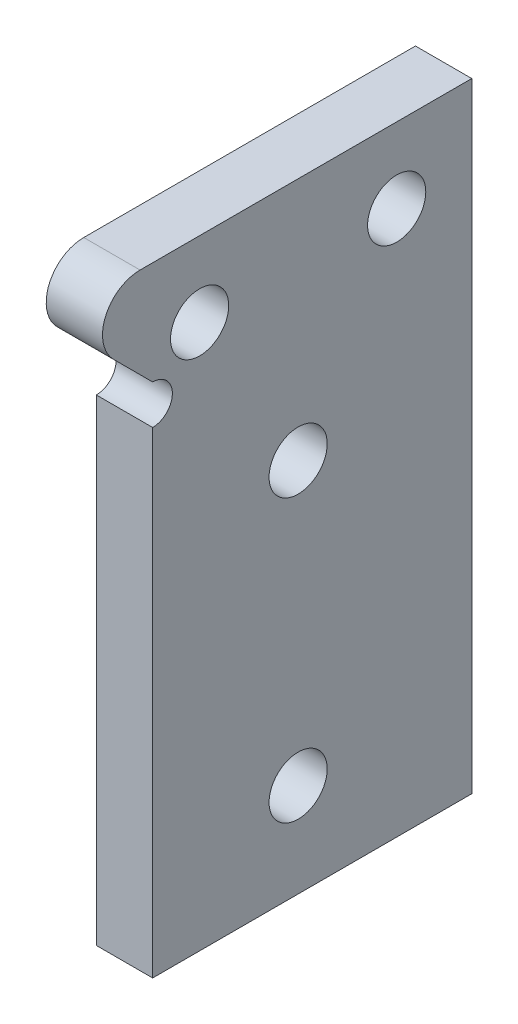
ISO-10303-21;
HEADER;
FILE_DESCRIPTION(('STEP AP214'),'2;1');
FILE_NAME('part.step','',(''),(''),'','','');
FILE_SCHEMA(('AUTOMOTIVE_DESIGN { 1 0 10303 214 1 1 1 1 }'));
ENDSEC;
DATA;
#1=APPLICATION_CONTEXT('core data for automotive mechanical design processes');
#2=APPLICATION_PROTOCOL_DEFINITION('international standard','automotive_design',2000,#1);
#3=PRODUCT_CONTEXT('',#1,'mechanical');
#4=PRODUCT('Part','Part','',(#3));
#5=PRODUCT_RELATED_PRODUCT_CATEGORY('part','',(#4));
#6=PRODUCT_DEFINITION_FORMATION('','',#4);
#7=PRODUCT_DEFINITION_CONTEXT('part definition',#1,'design');
#8=PRODUCT_DEFINITION('design','',#6,#7);
#9=PRODUCT_DEFINITION_SHAPE('','',#8);
#10=(LENGTH_UNIT() NAMED_UNIT(*) SI_UNIT(.MILLI.,.METRE.));
#11=(NAMED_UNIT(*) PLANE_ANGLE_UNIT() SI_UNIT($,.RADIAN.));
#12=(NAMED_UNIT(*) SI_UNIT($,.STERADIAN.) SOLID_ANGLE_UNIT());
#13=UNCERTAINTY_MEASURE_WITH_UNIT(LENGTH_MEASURE(1.E-05),#10,'distance_accuracy_value','');
#14=(GEOMETRIC_REPRESENTATION_CONTEXT(3) GLOBAL_UNCERTAINTY_ASSIGNED_CONTEXT((#13)) GLOBAL_UNIT_ASSIGNED_CONTEXT((#10,
#11,#12)) REPRESENTATION_CONTEXT('',''));
#15=CARTESIAN_POINT('',(0.,0.,0.));
#16=DIRECTION('',(0.,0.,1.));
#17=DIRECTION('',(1.,0.,0.));
#18=AXIS2_PLACEMENT_3D('',#15,#16,#17);
#19=CARTESIAN_POINT('',(3.,26.45,0.));
#20=DIRECTION('',(-1.,0.,0.));
#21=DIRECTION('',(0.,0.,1.));
#22=AXIS2_PLACEMENT_3D('',#19,#20,#21);
#23=CYLINDRICAL_SURFACE('',#22,1.05);
#24=CARTESIAN_POINT('',(0.,26.45,0.));
#25=DIRECTION('',(1.,0.,0.));
#26=DIRECTION('',(0.,0.,-1.));
#27=AXIS2_PLACEMENT_3D('',#24,#25,#26);
#28=CIRCLE('',#27,1.05);
#29=CARTESIAN_POINT('',(0.,25.4,0.));
#30=VERTEX_POINT('',#29);
#31=CARTESIAN_POINT('',(0.,27.5,0.));
#32=VERTEX_POINT('',#31);
#33=EDGE_CURVE('E96',#30,#32,#28,.T.);
#34=ORIENTED_EDGE('',*,*,#33,.F.);
#35=DIRECTION('',(-1.,0.,0.));
#36=VECTOR('',#35,1.);
#37=CARTESIAN_POINT('',(3.,25.4,0.));
#38=LINE('',#37,#36);
#39=CARTESIAN_POINT('',(3.,25.4,0.));
#40=VERTEX_POINT('',#39);
#41=EDGE_CURVE('E91',#40,#30,#38,.T.);
#42=ORIENTED_EDGE('',*,*,#41,.F.);
#43=CARTESIAN_POINT('',(3.,26.45,0.));
#44=DIRECTION('',(1.,0.,0.));
#45=DIRECTION('',(0.,0.,-1.));
#46=AXIS2_PLACEMENT_3D('',#43,#44,#45);
#47=CIRCLE('',#46,1.05);
#48=CARTESIAN_POINT('',(3.,27.5,0.));
#49=VERTEX_POINT('',#48);
#50=EDGE_CURVE('E93',#40,#49,#47,.T.);
#51=ORIENTED_EDGE('',*,*,#50,.T.);
#52=DIRECTION('',(-1.,0.,0.));
#53=VECTOR('',#52,1.);
#54=CARTESIAN_POINT('',(3.,27.5,0.));
#55=LINE('',#54,#53);
#56=EDGE_CURVE('E133',#49,#32,#55,.T.);
#57=ORIENTED_EDGE('',*,*,#56,.T.);
#58=EDGE_LOOP('',(#34,#42,#51,#57));
#59=FACE_BOUND('',#58,.T.);
#60=ADVANCED_FACE('F34',(#59),#23,.F.);
#61=CARTESIAN_POINT('',(3.,0.,0.));
#62=DIRECTION('',(0.,0.,1.));
#63=DIRECTION('',(1.,0.,0.));
#64=AXIS2_PLACEMENT_3D('',#61,#62,#63);
#65=PLANE('',#64);
#66=DIRECTION('',(0.,1.,0.));
#67=VECTOR('',#66,1.);
#68=CARTESIAN_POINT('',(0.,0.,0.));
#69=LINE('',#68,#67);
#70=CARTESIAN_POINT('',(0.,0.,0.));
#71=VERTEX_POINT('',#70);
#72=EDGE_CURVE('E141',#71,#30,#69,.T.);
#73=ORIENTED_EDGE('',*,*,#72,.F.);
#74=DIRECTION('',(-1.,0.,0.));
#75=VECTOR('',#74,1.);
#76=CARTESIAN_POINT('',(3.,0.,0.));
#77=LINE('',#76,#75);
#78=CARTESIAN_POINT('',(3.,0.,0.));
#79=VERTEX_POINT('',#78);
#80=EDGE_CURVE('E102',#79,#71,#77,.T.);
#81=ORIENTED_EDGE('',*,*,#80,.F.);
#82=DIRECTION('',(0.,1.,0.));
#83=VECTOR('',#82,1.);
#84=CARTESIAN_POINT('',(3.,0.,0.));
#85=LINE('',#84,#83);
#86=EDGE_CURVE('E109',#79,#40,#85,.T.);
#87=ORIENTED_EDGE('',*,*,#86,.T.);
#88=ORIENTED_EDGE('',*,*,#41,.T.);
#89=EDGE_LOOP('',(#73,#81,#87,#88));
#90=FACE_BOUND('',#89,.T.);
#91=ADVANCED_FACE('F115',(#90),#65,.T.);
#92=CARTESIAN_POINT('',(3.,0.,0.));
#93=DIRECTION('',(0.,-1.,0.));
#94=DIRECTION('',(0.,0.,-1.));
#95=AXIS2_PLACEMENT_3D('',#92,#93,#94);
#96=PLANE('',#95);
#97=DIRECTION('',(0.,0.,1.));
#98=VECTOR('',#97,1.);
#99=CARTESIAN_POINT('',(0.,0.,0.));
#100=LINE('',#99,#98);
#101=CARTESIAN_POINT('',(0.,0.,-17.));
#102=VERTEX_POINT('',#101);
#103=EDGE_CURVE('E143',#102,#71,#100,.T.);
#104=ORIENTED_EDGE('',*,*,#103,.F.);
#105=DIRECTION('',(-1.,0.,0.));
#106=VECTOR('',#105,1.);
#107=CARTESIAN_POINT('',(3.,0.,-17.));
#108=LINE('',#107,#106);
#109=CARTESIAN_POINT('',(3.,0.,-17.));
#110=VERTEX_POINT('',#109);
#111=EDGE_CURVE('E164',#110,#102,#108,.T.);
#112=ORIENTED_EDGE('',*,*,#111,.F.);
#113=DIRECTION('',(0.,0.,1.));
#114=VECTOR('',#113,1.);
#115=CARTESIAN_POINT('',(3.,0.,0.));
#116=LINE('',#115,#114);
#117=EDGE_CURVE('E116',#110,#79,#116,.T.);
#118=ORIENTED_EDGE('',*,*,#117,.T.);
#119=ORIENTED_EDGE('',*,*,#80,.T.);
#120=EDGE_LOOP('',(#104,#112,#118,#119));
#121=FACE_BOUND('',#120,.T.);
#122=ADVANCED_FACE('F180',(#121),#96,.T.);
#123=CARTESIAN_POINT('',(3.,0.,-17.));
#124=DIRECTION('',(0.,0.,-1.));
#125=DIRECTION('',(0.,1.,0.));
#126=AXIS2_PLACEMENT_3D('',#123,#124,#125);
#127=PLANE('',#126);
#128=DIRECTION('',(0.,-1.,0.));
#129=VECTOR('',#128,1.);
#130=CARTESIAN_POINT('',(0.,0.,-17.));
#131=LINE('',#130,#129);
#132=CARTESIAN_POINT('',(0.,33.,-17.));
#133=VERTEX_POINT('',#132);
#134=EDGE_CURVE('E146',#133,#102,#131,.T.);
#135=ORIENTED_EDGE('',*,*,#134,.F.);
#136=DIRECTION('',(-1.,0.,0.));
#137=VECTOR('',#136,1.);
#138=CARTESIAN_POINT('',(3.,33.,-17.));
#139=LINE('',#138,#137);
#140=CARTESIAN_POINT('',(3.,33.,-17.));
#141=VERTEX_POINT('',#140);
#142=EDGE_CURVE('E161',#141,#133,#139,.T.);
#143=ORIENTED_EDGE('',*,*,#142,.F.);
#144=DIRECTION('',(0.,-1.,0.));
#145=VECTOR('',#144,1.);
#146=CARTESIAN_POINT('',(3.,0.,-17.));
#147=LINE('',#146,#145);
#148=EDGE_CURVE('E118',#141,#110,#147,.T.);
#149=ORIENTED_EDGE('',*,*,#148,.T.);
#150=ORIENTED_EDGE('',*,*,#111,.T.);
#151=EDGE_LOOP('',(#135,#143,#149,#150));
#152=FACE_BOUND('',#151,.T.);
#153=ADVANCED_FACE('F184',(#152),#127,.T.);
#154=CARTESIAN_POINT('',(3.,33.,0.));
#155=DIRECTION('',(0.,1.,0.));
#156=DIRECTION('',(0.,0.,1.));
#157=AXIS2_PLACEMENT_3D('',#154,#155,#156);
#158=PLANE('',#157);
#159=DIRECTION('',(0.,0.,-1.));
#160=VECTOR('',#159,1.);
#161=CARTESIAN_POINT('',(0.,33.,0.));
#162=LINE('',#161,#160);
#163=CARTESIAN_POINT('',(0.,33.,0.671572875253822));
#164=VERTEX_POINT('',#163);
#165=EDGE_CURVE('E149',#164,#133,#162,.T.);
#166=ORIENTED_EDGE('',*,*,#165,.F.);
#167=DIRECTION('',(-1.,0.,0.));
#168=VECTOR('',#167,1.);
#169=CARTESIAN_POINT('',(3.,33.,0.671572875253822));
#170=LINE('',#169,#168);
#171=CARTESIAN_POINT('',(3.,33.,0.671572875253822));
#172=VERTEX_POINT('',#171);
#173=EDGE_CURVE('E42',#164,#172,#170,.F.);
#174=ORIENTED_EDGE('',*,*,#173,.T.);
#175=DIRECTION('',(0.,0.,-1.));
#176=VECTOR('',#175,1.);
#177=CARTESIAN_POINT('',(3.,33.,0.));
#178=LINE('',#177,#176);
#179=EDGE_CURVE('E124',#172,#141,#178,.T.);
#180=ORIENTED_EDGE('',*,*,#179,.T.);
#181=ORIENTED_EDGE('',*,*,#142,.T.);
#182=EDGE_LOOP('',(#166,#174,#180,#181));
#183=FACE_BOUND('',#182,.T.);
#184=ADVANCED_FACE('F185',(#183),#158,.T.);
#185=CARTESIAN_POINT('',(3.,29.,-13.));
#186=DIRECTION('',(-1.,0.,0.));
#187=DIRECTION('',(0.,0.,1.));
#188=AXIS2_PLACEMENT_3D('',#185,#186,#187);
#189=CYLINDRICAL_SURFACE('',#188,1.55);
#190=CARTESIAN_POINT('',(3.,29.,-13.));
#191=DIRECTION('',(1.,0.,0.));
#192=DIRECTION('',(0.,0.,-1.));
#193=AXIS2_PLACEMENT_3D('',#190,#191,#192);
#194=CIRCLE('',#193,1.55);
#195=CARTESIAN_POINT('',(3.,29.,-14.55));
#196=VERTEX_POINT('',#195);
#197=EDGE_CURVE('E127',#196,#196,#194,.T.);
#198=ORIENTED_EDGE('',*,*,#197,.T.);
#199=EDGE_LOOP('',(#198));
#200=FACE_BOUND('',#199,.T.);
#201=CARTESIAN_POINT('',(0.,29.,-13.));
#202=DIRECTION('',(1.,0.,0.));
#203=DIRECTION('',(0.,0.,-1.));
#204=AXIS2_PLACEMENT_3D('',#201,#202,#203);
#205=CIRCLE('',#204,1.55);
#206=CARTESIAN_POINT('',(0.,29.,-14.55));
#207=VERTEX_POINT('',#206);
#208=EDGE_CURVE('E153',#207,#207,#205,.T.);
#209=ORIENTED_EDGE('',*,*,#208,.F.);
#210=EDGE_LOOP('',(#209));
#211=FACE_BOUND('',#210,.T.);
#212=ADVANCED_FACE('F229',(#200,#211),#189,.F.);
#213=CARTESIAN_POINT('',(3.,13.75,-13.75));
#214=DIRECTION('',(0.,-0.707106781186549,0.707106781186546));
#215=DIRECTION('',(0.,-0.707106781186546,-0.707106781186549));
#216=AXIS2_PLACEMENT_3D('',#213,#214,#215);
#217=PLANE('',#216);
#218=DIRECTION('',(0.,0.707106781186546,0.707106781186549));
#219=VECTOR('',#218,1.);
#220=CARTESIAN_POINT('',(3.,13.75,-13.75));
#221=LINE('',#220,#219);
#222=CARTESIAN_POINT('',(3.,29.5857864376269,2.08578643762692));
#223=VERTEX_POINT('',#222);
#224=EDGE_CURVE('E112',#49,#223,#221,.T.);
#225=ORIENTED_EDGE('',*,*,#224,.T.);
#226=DIRECTION('',(-1.,0.,0.));
#227=VECTOR('',#226,1.);
#228=CARTESIAN_POINT('',(3.,29.5857864376269,2.08578643762691));
#229=LINE('',#228,#227);
#230=CARTESIAN_POINT('',(0.,29.5857864376269,2.08578643762692));
#231=VERTEX_POINT('',#230);
#232=EDGE_CURVE('E101',#223,#231,#229,.T.);
#233=ORIENTED_EDGE('',*,*,#232,.T.);
#234=DIRECTION('',(0.,0.707106781186546,0.707106781186549));
#235=VECTOR('',#234,1.);
#236=CARTESIAN_POINT('',(0.,13.75,-13.75));
#237=LINE('',#236,#235);
#238=EDGE_CURVE('E151',#32,#231,#237,.T.);
#239=ORIENTED_EDGE('',*,*,#238,.F.);
#240=ORIENTED_EDGE('',*,*,#56,.F.);
#241=EDGE_LOOP('',(#225,#233,#239,#240));
#242=FACE_BOUND('',#241,.T.);
#243=ADVANCED_FACE('F172',(#242),#217,.T.);
#244=CARTESIAN_POINT('',(3.,20.,-7.75));
#245=DIRECTION('',(-1.,0.,0.));
#246=DIRECTION('',(0.,0.,1.));
#247=AXIS2_PLACEMENT_3D('',#244,#245,#246);
#248=CYLINDRICAL_SURFACE('',#247,1.55);
#249=CARTESIAN_POINT('',(3.,20.,-7.75));
#250=DIRECTION('',(1.,0.,0.));
#251=DIRECTION('',(0.,0.,-1.));
#252=AXIS2_PLACEMENT_3D('',#249,#250,#251);
#253=CIRCLE('',#252,1.55);
#254=CARTESIAN_POINT('',(3.,20.,-9.3));
#255=VERTEX_POINT('',#254);
#256=EDGE_CURVE('E113',#255,#255,#253,.T.);
#257=ORIENTED_EDGE('',*,*,#256,.T.);
#258=EDGE_LOOP('',(#257));
#259=FACE_BOUND('',#258,.T.);
#260=CARTESIAN_POINT('',(0.,20.,-7.75));
#261=DIRECTION('',(1.,0.,0.));
#262=DIRECTION('',(0.,0.,-1.));
#263=AXIS2_PLACEMENT_3D('',#260,#261,#262);
#264=CIRCLE('',#263,1.55);
#265=CARTESIAN_POINT('',(0.,20.,-9.3));
#266=VERTEX_POINT('',#265);
#267=EDGE_CURVE('E137',#266,#266,#264,.T.);
#268=ORIENTED_EDGE('',*,*,#267,.F.);
#269=EDGE_LOOP('',(#268));
#270=FACE_BOUND('',#269,.T.);
#271=ADVANCED_FACE('F200',(#259,#270),#248,.F.);
#272=CARTESIAN_POINT('',(3.,5.,-7.75));
#273=DIRECTION('',(-1.,0.,0.));
#274=DIRECTION('',(0.,0.,1.));
#275=AXIS2_PLACEMENT_3D('',#272,#273,#274);
#276=CYLINDRICAL_SURFACE('',#275,1.55);
#277=CARTESIAN_POINT('',(3.,5.,-7.75));
#278=DIRECTION('',(1.,0.,0.));
#279=DIRECTION('',(0.,0.,-1.));
#280=AXIS2_PLACEMENT_3D('',#277,#278,#279);
#281=CIRCLE('',#280,1.55);
#282=CARTESIAN_POINT('',(3.,5.,-9.3));
#283=VERTEX_POINT('',#282);
#284=EDGE_CURVE('E159',#283,#283,#281,.T.);
#285=ORIENTED_EDGE('',*,*,#284,.T.);
#286=EDGE_LOOP('',(#285));
#287=FACE_BOUND('',#286,.T.);
#288=CARTESIAN_POINT('',(0.,5.,-7.75));
#289=DIRECTION('',(1.,0.,0.));
#290=DIRECTION('',(0.,0.,-1.));
#291=AXIS2_PLACEMENT_3D('',#288,#289,#290);
#292=CIRCLE('',#291,1.55);
#293=CARTESIAN_POINT('',(0.,5.,-9.3));
#294=VERTEX_POINT('',#293);
#295=EDGE_CURVE('E134',#294,#294,#292,.T.);
#296=ORIENTED_EDGE('',*,*,#295,.F.);
#297=EDGE_LOOP('',(#296));
#298=FACE_BOUND('',#297,.T.);
#299=ADVANCED_FACE('F202',(#287,#298),#276,.F.);
#300=CARTESIAN_POINT('',(3.,29.,-2.5));
#301=DIRECTION('',(-1.,0.,0.));
#302=DIRECTION('',(0.,0.,1.));
#303=AXIS2_PLACEMENT_3D('',#300,#301,#302);
#304=CYLINDRICAL_SURFACE('',#303,1.55);
#305=CARTESIAN_POINT('',(3.,29.,-2.5));
#306=DIRECTION('',(1.,0.,0.));
#307=DIRECTION('',(0.,0.,-1.));
#308=AXIS2_PLACEMENT_3D('',#305,#306,#307);
#309=CIRCLE('',#308,1.55);
#310=CARTESIAN_POINT('',(3.,29.,-4.05));
#311=VERTEX_POINT('',#310);
#312=EDGE_CURVE('E130',#311,#311,#309,.T.);
#313=ORIENTED_EDGE('',*,*,#312,.T.);
#314=EDGE_LOOP('',(#313));
#315=FACE_BOUND('',#314,.T.);
#316=CARTESIAN_POINT('',(0.,29.,-2.5));
#317=DIRECTION('',(1.,0.,0.));
#318=DIRECTION('',(0.,0.,-1.));
#319=AXIS2_PLACEMENT_3D('',#316,#317,#318);
#320=CIRCLE('',#319,1.55);
#321=CARTESIAN_POINT('',(0.,29.,-4.05));
#322=VERTEX_POINT('',#321);
#323=EDGE_CURVE('E156',#322,#322,#320,.T.);
#324=ORIENTED_EDGE('',*,*,#323,.F.);
#325=EDGE_LOOP('',(#324));
#326=FACE_BOUND('',#325,.T.);
#327=ADVANCED_FACE('F205',(#315,#326),#304,.F.);
#328=CARTESIAN_POINT('',(3.,0.,0.));
#329=DIRECTION('',(1.,0.,0.));
#330=DIRECTION('',(0.,0.,-1.));
#331=AXIS2_PLACEMENT_3D('',#328,#329,#330);
#332=PLANE('',#331);
#333=ORIENTED_EDGE('',*,*,#284,.F.);
#334=EDGE_LOOP('',(#333));
#335=FACE_BOUND('',#334,.T.);
#336=ORIENTED_EDGE('',*,*,#256,.F.);
#337=EDGE_LOOP('',(#336));
#338=FACE_BOUND('',#337,.T.);
#339=ORIENTED_EDGE('',*,*,#179,.F.);
#340=CARTESIAN_POINT('',(3.,31.,0.671572875253823));
#341=DIRECTION('',(1.,0.,0.));
#342=DIRECTION('',(0.,0.,-1.));
#343=AXIS2_PLACEMENT_3D('',#340,#341,#342);
#344=CIRCLE('',#343,2.);
#345=EDGE_CURVE('E11',#172,#223,#344,.T.);
#346=ORIENTED_EDGE('',*,*,#345,.T.);
#347=ORIENTED_EDGE('',*,*,#224,.F.);
#348=ORIENTED_EDGE('',*,*,#50,.F.);
#349=ORIENTED_EDGE('',*,*,#86,.F.);
#350=ORIENTED_EDGE('',*,*,#117,.F.);
#351=ORIENTED_EDGE('',*,*,#148,.F.);
#352=EDGE_LOOP('',(#339,#346,#347,#348,#349,#350,#351));
#353=FACE_BOUND('',#352,.T.);
#354=ORIENTED_EDGE('',*,*,#197,.F.);
#355=EDGE_LOOP('',(#354));
#356=FACE_BOUND('',#355,.T.);
#357=ORIENTED_EDGE('',*,*,#312,.F.);
#358=EDGE_LOOP('',(#357));
#359=FACE_BOUND('',#358,.T.);
#360=ADVANCED_FACE('F106',(#335,#338,#353,#356,#359),#332,.T.);
#361=CARTESIAN_POINT('',(0.,0.,0.));
#362=DIRECTION('',(1.,0.,0.));
#363=DIRECTION('',(0.,0.,-1.));
#364=AXIS2_PLACEMENT_3D('',#361,#362,#363);
#365=PLANE('',#364);
#366=ORIENTED_EDGE('',*,*,#295,.T.);
#367=EDGE_LOOP('',(#366));
#368=FACE_BOUND('',#367,.T.);
#369=ORIENTED_EDGE('',*,*,#267,.T.);
#370=EDGE_LOOP('',(#369));
#371=FACE_BOUND('',#370,.T.);
#372=ORIENTED_EDGE('',*,*,#238,.T.);
#373=CARTESIAN_POINT('',(0.,31.,0.671572875253823));
#374=DIRECTION('',(1.,0.,0.));
#375=DIRECTION('',(0.,0.,-1.));
#376=AXIS2_PLACEMENT_3D('',#373,#374,#375);
#377=CIRCLE('',#376,2.);
#378=EDGE_CURVE('E56',#231,#164,#377,.F.);
#379=ORIENTED_EDGE('',*,*,#378,.T.);
#380=ORIENTED_EDGE('',*,*,#165,.T.);
#381=ORIENTED_EDGE('',*,*,#134,.T.);
#382=ORIENTED_EDGE('',*,*,#103,.T.);
#383=ORIENTED_EDGE('',*,*,#72,.T.);
#384=ORIENTED_EDGE('',*,*,#33,.T.);
#385=EDGE_LOOP('',(#372,#379,#380,#381,#382,#383,#384));
#386=FACE_BOUND('',#385,.T.);
#387=ORIENTED_EDGE('',*,*,#208,.T.);
#388=EDGE_LOOP('',(#387));
#389=FACE_BOUND('',#388,.T.);
#390=ORIENTED_EDGE('',*,*,#323,.T.);
#391=EDGE_LOOP('',(#390));
#392=FACE_BOUND('',#391,.T.);
#393=ADVANCED_FACE('F175',(#368,#371,#386,#389,#392),#365,.F.);
#394=CARTESIAN_POINT('',(3.,31.,0.671572875253823));
#395=DIRECTION('',(-1.,0.,0.));
#396=DIRECTION('',(0.,0.,1.));
#397=AXIS2_PLACEMENT_3D('',#394,#395,#396);
#398=CYLINDRICAL_SURFACE('',#397,2.);
#399=ORIENTED_EDGE('',*,*,#345,.F.);
#400=ORIENTED_EDGE('',*,*,#173,.F.);
#401=ORIENTED_EDGE('',*,*,#378,.F.);
#402=ORIENTED_EDGE('',*,*,#232,.F.);
#403=EDGE_LOOP('',(#399,#400,#401,#402));
#404=FACE_BOUND('',#403,.T.);
#405=ADVANCED_FACE('F36',(#404),#398,.T.);
#406=CLOSED_SHELL('',(#60,#91,#122,#153,#184,#212,#243,#271,#299,#327,#360,#393,#405));
#407=MANIFOLD_SOLID_BREP('B2',#406);
#408=ADVANCED_BREP_SHAPE_REPRESENTATION('',(#18,#407),#14);
#409=SHAPE_DEFINITION_REPRESENTATION(#9,#408);
ENDSEC;
END-ISO-10303-21;
